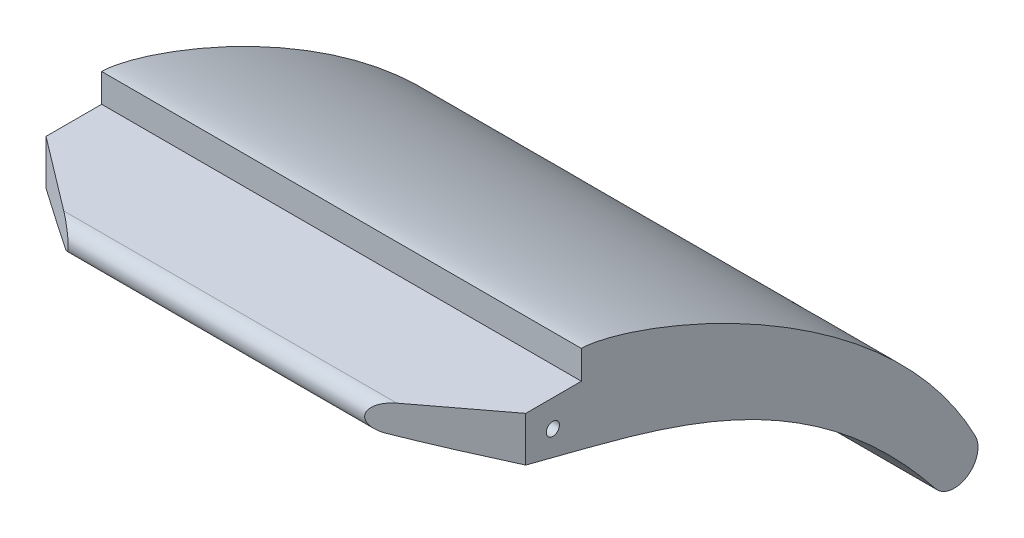
ISO-10303-21;
HEADER;
FILE_DESCRIPTION(('STEP AP214'),'2;1');
FILE_NAME('part.step','',(''),(''),'','','');
FILE_SCHEMA(('AUTOMOTIVE_DESIGN { 1 0 10303 214 1 1 1 1 }'));
ENDSEC;
DATA;
#1=APPLICATION_CONTEXT('core data for automotive mechanical design processes');
#2=APPLICATION_PROTOCOL_DEFINITION('international standard','automotive_design',2000,#1);
#3=PRODUCT_CONTEXT('',#1,'mechanical');
#4=PRODUCT('Part','Part','',(#3));
#5=PRODUCT_RELATED_PRODUCT_CATEGORY('part','',(#4));
#6=PRODUCT_DEFINITION_FORMATION('','',#4);
#7=PRODUCT_DEFINITION_CONTEXT('part definition',#1,'design');
#8=PRODUCT_DEFINITION('design','',#6,#7);
#9=PRODUCT_DEFINITION_SHAPE('','',#8);
#10=(LENGTH_UNIT() NAMED_UNIT(*) SI_UNIT(.MILLI.,.METRE.));
#11=(NAMED_UNIT(*) PLANE_ANGLE_UNIT() SI_UNIT($,.RADIAN.));
#12=(NAMED_UNIT(*) SI_UNIT($,.STERADIAN.) SOLID_ANGLE_UNIT());
#13=UNCERTAINTY_MEASURE_WITH_UNIT(LENGTH_MEASURE(1.E-05),#10,'distance_accuracy_value','');
#14=(GEOMETRIC_REPRESENTATION_CONTEXT(3) GLOBAL_UNCERTAINTY_ASSIGNED_CONTEXT((#13)) GLOBAL_UNIT_ASSIGNED_CONTEXT((#10,
#11,#12)) REPRESENTATION_CONTEXT('',''));
#15=CARTESIAN_POINT('',(0.,0.,0.));
#16=DIRECTION('',(0.,0.,1.));
#17=DIRECTION('',(1.,0.,0.));
#18=AXIS2_PLACEMENT_3D('',#15,#16,#17);
#19=CARTESIAN_POINT('',(82.55,-11.5520753106757,-24.6556689200418));
#20=DIRECTION('',(-1.,0.,0.));
#21=DIRECTION('',(0.,0.,1.));
#22=AXIS2_PLACEMENT_3D('',#19,#20,#21);
#23=PLANE('',#22);
#24=DIRECTION('',(0.,0.,1.));
#25=VECTOR('',#24,1.);
#26=CARTESIAN_POINT('',(82.55,4.6355,14.2350370609778));
#27=LINE('',#26,#25);
#28=CARTESIAN_POINT('',(82.55,4.6355,-4.91161356874394));
#29=VERTEX_POINT('',#28);
#30=CARTESIAN_POINT('',(82.55,4.6355,4.66171174611691));
#31=VERTEX_POINT('',#30);
#32=EDGE_CURVE('E111',#29,#31,#27,.T.);
#33=ORIENTED_EDGE('',*,*,#32,.T.);
#34=DIRECTION('',(0.,1.,0.));
#35=VECTOR('',#34,1.);
#36=CARTESIAN_POINT('',(82.55,-43.4000524434464,4.66171174611692));
#37=LINE('',#36,#35);
#38=CARTESIAN_POINT('',(82.55,-3.07681509877804,4.66171174611691));
#39=VERTEX_POINT('',#38);
#40=EDGE_CURVE('E99',#39,#31,#37,.T.);
#41=ORIENTED_EDGE('',*,*,#40,.F.);
#42=CARTESIAN_POINT('',(82.55,0.,15.0043695834243));
#43=CARTESIAN_POINT('',(82.55,-8.32117200788797,-9.37411641729812));
#44=CARTESIAN_POINT('',(82.55,-8.5343658913165,-39.4233813649988));
#45=CARTESIAN_POINT('',(82.55,-41.849988787792,-65.857227596868));
#46=B_SPLINE_CURVE_WITH_KNOTS('',3,(#42,#43,#44,#45),.UNSPECIFIED.,.F.,.F.,(4,4),(0.,1.),.UNSPECIFIED.);
#47=CARTESIAN_POINT('',(82.55,-41.8499887877919,-65.8572275968679));
#48=VERTEX_POINT('',#47);
#49=EDGE_CURVE('E146',#39,#48,#46,.T.);
#50=ORIENTED_EDGE('',*,*,#49,.T.);
#51=CARTESIAN_POINT('',(82.55,-39.3041759977397,-69.0658162424412));
#52=DIRECTION('',(1.,0.,0.));
#53=DIRECTION('',(0.,0.,1.));
#54=AXIS2_PLACEMENT_3D('',#51,#52,#53);
#55=CIRCLE('',#54,4.09587644570674);
#56=CARTESIAN_POINT('',(82.55,-37.4179314701647,-72.7015122474296));
#57=VERTEX_POINT('',#56);
#58=EDGE_CURVE('E215',#48,#57,#55,.T.);
#59=ORIENTED_EDGE('',*,*,#58,.T.);
#60=CARTESIAN_POINT('',(82.55,-37.4179314701647,-72.7015122474296));
#61=CARTESIAN_POINT('',(82.55,-6.98888389724203,-56.9145420538283));
#62=CARTESIAN_POINT('',(82.55,9.52500000000001,-13.3568598094038));
#63=CARTESIAN_POINT('',(82.55,9.52500000000001,-4.91161356874394));
#64=B_SPLINE_CURVE_WITH_KNOTS('',3,(#60,#61,#62,#63),.UNSPECIFIED.,.F.,.F.,(4,4),(0.,1.),.UNSPECIFIED.);
#65=CARTESIAN_POINT('',(82.55,9.525,-4.91161356874394));
#66=VERTEX_POINT('',#65);
#67=EDGE_CURVE('E121',#57,#66,#64,.T.);
#68=ORIENTED_EDGE('',*,*,#67,.T.);
#69=DIRECTION('',(0.,-1.,0.));
#70=VECTOR('',#69,1.);
#71=CARTESIAN_POINT('',(82.55,4.6355,-4.91161356874394));
#72=LINE('',#71,#70);
#73=EDGE_CURVE('E117',#66,#29,#72,.T.);
#74=ORIENTED_EDGE('',*,*,#73,.T.);
#75=EDGE_LOOP('',(#33,#41,#50,#59,#68,#74));
#76=FACE_BOUND('',#75,.T.);
#77=CARTESIAN_POINT('',(82.55,0.,0.));
#78=DIRECTION('',(1.,0.,0.));
#79=DIRECTION('',(0.,0.,-1.));
#80=AXIS2_PLACEMENT_3D('',#77,#78,#79);
#81=CIRCLE('',#80,1.1303);
#82=CARTESIAN_POINT('',(82.55,0.,-1.1303));
#83=VERTEX_POINT('',#82);
#84=EDGE_CURVE('E130',#83,#83,#81,.T.);
#85=ORIENTED_EDGE('',*,*,#84,.F.);
#86=EDGE_LOOP('',(#85));
#87=FACE_BOUND('',#86,.T.);
#88=ADVANCED_FACE('F33',(#76,#87),#23,.F.);
#89=CARTESIAN_POINT('',(0.,-11.5520753106757,-24.6556689200418));
#90=DIRECTION('',(-1.,0.,0.));
#91=DIRECTION('',(0.,0.,1.));
#92=AXIS2_PLACEMENT_3D('',#89,#90,#91);
#93=PLANE('',#92);
#94=DIRECTION('',(0.,1.,0.));
#95=VECTOR('',#94,1.);
#96=CARTESIAN_POINT('',(0.,-43.4000524434464,4.66171174611692));
#97=LINE('',#96,#95);
#98=CARTESIAN_POINT('',(0.,-3.07681509877804,4.66171174611691));
#99=VERTEX_POINT('',#98);
#100=CARTESIAN_POINT('',(0.,4.6355,4.66171174611691));
#101=VERTEX_POINT('',#100);
#102=EDGE_CURVE('E169',#99,#101,#97,.T.);
#103=ORIENTED_EDGE('',*,*,#102,.T.);
#104=DIRECTION('',(0.,0.,1.));
#105=VECTOR('',#104,1.);
#106=CARTESIAN_POINT('',(0.,4.6355,14.2350370609778));
#107=LINE('',#106,#105);
#108=CARTESIAN_POINT('',(0.,4.6355,-4.91161356874394));
#109=VERTEX_POINT('',#108);
#110=EDGE_CURVE('E144',#109,#101,#107,.T.);
#111=ORIENTED_EDGE('',*,*,#110,.F.);
#112=DIRECTION('',(0.,-1.,0.));
#113=VECTOR('',#112,1.);
#114=CARTESIAN_POINT('',(0.,4.6355,-4.91161356874394));
#115=LINE('',#114,#113);
#116=CARTESIAN_POINT('',(0.,9.525,-4.91161356874394));
#117=VERTEX_POINT('',#116);
#118=EDGE_CURVE('E139',#117,#109,#115,.T.);
#119=ORIENTED_EDGE('',*,*,#118,.F.);
#120=CARTESIAN_POINT('',(0.,-37.4179314701647,-72.7015122474296));
#121=CARTESIAN_POINT('',(0.,-6.98888389724203,-56.9145420538283));
#122=CARTESIAN_POINT('',(0.,9.52500000000001,-13.3568598094038));
#123=CARTESIAN_POINT('',(0.,9.52500000000001,-4.91161356874394));
#124=B_SPLINE_CURVE_WITH_KNOTS('',3,(#120,#121,#122,#123),.UNSPECIFIED.,.F.,.F.,(4,4),(0.,1.),.UNSPECIFIED.);
#125=CARTESIAN_POINT('',(0.,-37.4179314701647,-72.7015122474296));
#126=VERTEX_POINT('',#125);
#127=EDGE_CURVE('E135',#126,#117,#124,.T.);
#128=ORIENTED_EDGE('',*,*,#127,.F.);
#129=CARTESIAN_POINT('',(0.,-39.3041759977397,-69.0658162424412));
#130=DIRECTION('',(1.,0.,0.));
#131=DIRECTION('',(0.,0.,1.));
#132=AXIS2_PLACEMENT_3D('',#129,#130,#131);
#133=CIRCLE('',#132,4.09587644570674);
#134=CARTESIAN_POINT('',(0.,-41.8499887877919,-65.8572275968679));
#135=VERTEX_POINT('',#134);
#136=EDGE_CURVE('E129',#135,#126,#133,.T.);
#137=ORIENTED_EDGE('',*,*,#136,.F.);
#138=CARTESIAN_POINT('',(0.,0.,15.0043695834243));
#139=CARTESIAN_POINT('',(0.,-8.32117200788797,-9.37411641729812));
#140=CARTESIAN_POINT('',(0.,-8.5343658913165,-39.4233813649988));
#141=CARTESIAN_POINT('',(0.,-41.849988787792,-65.857227596868));
#142=B_SPLINE_CURVE_WITH_KNOTS('',3,(#138,#139,#140,#141),.UNSPECIFIED.,.F.,.F.,(4,4),(0.,1.),.UNSPECIFIED.);
#143=EDGE_CURVE('E125',#99,#135,#142,.T.);
#144=ORIENTED_EDGE('',*,*,#143,.F.);
#145=EDGE_LOOP('',(#103,#111,#119,#128,#137,#144));
#146=FACE_BOUND('',#145,.T.);
#147=CARTESIAN_POINT('',(0.,0.,0.));
#148=DIRECTION('',(1.,0.,0.));
#149=DIRECTION('',(0.,0.,-1.));
#150=AXIS2_PLACEMENT_3D('',#147,#148,#149);
#151=CIRCLE('',#150,1.1303);
#152=CARTESIAN_POINT('',(0.,0.,-1.1303));
#153=VERTEX_POINT('',#152);
#154=EDGE_CURVE('E183',#153,#153,#151,.T.);
#155=ORIENTED_EDGE('',*,*,#154,.T.);
#156=EDGE_LOOP('',(#155));
#157=FACE_BOUND('',#156,.T.);
#158=ADVANCED_FACE('F195',(#146,#157),#93,.T.);
#159=DIRECTION('',(-1.,0.,0.));
#160=VECTOR('',#159,1.);
#161=SURFACE_OF_LINEAR_EXTRUSION('',#46,#160);
#162=ORIENTED_EDGE('',*,*,#49,.F.);
#163=CARTESIAN_POINT('',(82.5499999999755,-3.07681509877715,4.66171174618639));
#164=CARTESIAN_POINT('',(82.093866387548,-2.98455770400678,5.00758860997064));
#165=CARTESIAN_POINT('',(81.6378136555069,-2.89166639047412,5.35340414381812));
#166=CARTESIAN_POINT('',(80.7259305421681,-2.70439216075581,6.04486660747262));
#167=CARTESIAN_POINT('',(80.2701001492855,-2.61000933337655,6.39051354606417));
#168=CARTESIAN_POINT('',(79.3586922097506,-2.41952244197865,7.08161569507635));
#169=CARTESIAN_POINT('',(78.9031146510341,-2.32341846897501,7.42707091464502));
#170=CARTESIAN_POINT('',(77.9922443492805,-2.12925152533336,8.1177653838324));
#171=CARTESIAN_POINT('',(77.5369515949778,-2.03118863799767,8.46300464199364));
#172=CARTESIAN_POINT('',(76.6266836342697,-1.83285960739144,9.15324236818809));
#173=CARTESIAN_POINT('',(76.1717084193955,-1.73259352539228,9.49824084264292));
#174=CARTESIAN_POINT('',(75.262091509596,-1.52960240861048,10.1879848901423));
#175=CARTESIAN_POINT('',(74.8074498254858,-1.42687729743348,10.5327304549859));
#176=CARTESIAN_POINT('',(73.8985567652707,-1.21871338889748,11.2219256220315));
#177=CARTESIAN_POINT('',(73.4443053924816,-1.11327456871656,11.5663752217194));
#178=CARTESIAN_POINT('',(72.536233532883,-0.899416513594967,12.2549476889989));
#179=CARTESIAN_POINT('',(72.0824130597402,-0.790997187187326,12.5990705462274));
#180=CARTESIAN_POINT('',(71.1752444679711,-0.570903365899336,13.2869580838382));
#181=CARTESIAN_POINT('',(70.721896379558,-0.459228674633927,13.6307227413105));
#182=CARTESIAN_POINT('',(69.8157169234941,-0.232338175340028,14.3178602373846));
#183=CARTESIAN_POINT('',(69.362885611221,-0.117122019117585,14.6612330339947));
#184=CARTESIAN_POINT('',(68.9103658557217,0.,15.0043695834243));
#185=B_SPLINE_CURVE_WITH_KNOTS('',3,(#163,#164,#165,#166,#167,#168,#169,#170,#171,#172,#173,
#174,#175,#176,#177,#178,#179,#180,#181,#182,#183,#184),.UNSPECIFIED.,.F.,.F.,(4,2,2,2,2,2,2,2,
2,2,4),(0.,1.73948357403816,3.4788639646314,5.21815264595893,6.95736752127614,8.6965340896618,
10.4357547588221,12.1749900593761,13.9142787939952,15.653672672004,17.3932381162987),.UNSPECIFIED.);
#186=CARTESIAN_POINT('',(68.9103658557218,0.,15.0043695834243));
#187=VERTEX_POINT('',#186);
#188=EDGE_CURVE('E101',#39,#187,#185,.T.);
#189=ORIENTED_EDGE('',*,*,#188,.T.);
#190=DIRECTION('',(-1.,0.,0.));
#191=VECTOR('',#190,1.);
#192=CARTESIAN_POINT('',(82.55,0.,15.0043695834243));
#193=LINE('',#192,#191);
#194=CARTESIAN_POINT('',(13.6396341442782,0.,15.0043695834243));
#195=VERTEX_POINT('',#194);
#196=EDGE_CURVE('E57',#187,#195,#193,.T.);
#197=ORIENTED_EDGE('',*,*,#196,.T.);
#198=CARTESIAN_POINT('',(13.6396341442782,0.,15.0043695834243));
#199=CARTESIAN_POINT('',(13.187114388779,-0.117122019117582,14.6612330339947));
#200=CARTESIAN_POINT('',(12.734283076506,-0.23233817534002,14.3178602373846));
#201=CARTESIAN_POINT('',(11.8281036204421,-0.45922867463391,13.6307227413105));
#202=CARTESIAN_POINT('',(11.374755532029,-0.570903365899313,13.2869580838383));
#203=CARTESIAN_POINT('',(10.4675869402599,-0.790997187187295,12.5990705462275));
#204=CARTESIAN_POINT('',(10.0137664671172,-0.899416513594932,12.254947688999));
#205=CARTESIAN_POINT('',(9.1056946075186,-1.11327456871652,11.5663752217195));
#206=CARTESIAN_POINT('',(8.65144323472946,-1.21871338889744,11.2219256220317));
#207=CARTESIAN_POINT('',(7.74255017451444,-1.42687729743343,10.532730454986));
#208=CARTESIAN_POINT('',(7.28790849040424,-1.52960240861043,10.1879848901425));
#209=CARTESIAN_POINT('',(6.37829158060475,-1.73259352539224,9.49824084264309));
#210=CARTESIAN_POINT('',(5.92331636573063,-1.83285960739141,9.15324236818822));
#211=CARTESIAN_POINT('',(5.0130484050224,-2.03118863799758,8.46300464199391));
#212=CARTESIAN_POINT('',(4.55775565071959,-2.12925152533318,8.11776538383283));
#213=CARTESIAN_POINT('',(3.64688534896644,-2.32341846897506,7.42707091464506));
#214=CARTESIAN_POINT('',(3.19130779025042,-2.41952244197901,7.08161569507582));
#215=CARTESIAN_POINT('',(2.27989985071418,-2.61000933337604,6.39051354606525));
#216=CARTESIAN_POINT('',(1.82406945782976,-2.70439216075411,6.04486660747587));
#217=CARTESIAN_POINT('',(0.912186344496103,-2.89166639047565,5.35340414381551));
#218=CARTESIAN_POINT('',(0.45613361246206,-2.98455770401271,5.00758860996001));
#219=CARTESIAN_POINT('',(5.17225151597245E-11,-3.07681509879383,4.66171174615614));
#220=B_SPLINE_CURVE_WITH_KNOTS('',3,(#198,#199,#200,#201,#202,#203,#204,#205,#206,#207,#208,
#209,#210,#211,#212,#213,#214,#215,#216,#217,#218,#219),.UNSPECIFIED.,.F.,.F.,(4,2,2,2,2,2,2,2,
2,2,4),(0.,1.73956544429455,3.47895932230328,5.21824805692232,6.95748335747634,8.69670402663656,
10.4358705950222,12.1750854703393,13.9143741516668,15.65375454226,17.393238116298),.UNSPECIFIED.);
#221=EDGE_CURVE('E167',#195,#99,#220,.T.);
#222=ORIENTED_EDGE('',*,*,#221,.T.);
#223=ORIENTED_EDGE('',*,*,#143,.T.);
#224=DIRECTION('',(-1.,0.,0.));
#225=VECTOR('',#224,1.);
#226=CARTESIAN_POINT('',(82.55,-41.8499887877919,-65.8572275968679));
#227=LINE('',#226,#225);
#228=EDGE_CURVE('E157',#48,#135,#227,.T.);
#229=ORIENTED_EDGE('',*,*,#228,.F.);
#230=EDGE_LOOP('',(#162,#189,#197,#222,#223,#229));
#231=FACE_BOUND('',#230,.T.);
#232=ADVANCED_FACE('F35',(#231),#161,.F.);
#233=CARTESIAN_POINT('',(82.55,-39.3041759977397,-69.0658162424412));
#234=DIRECTION('',(-1.,0.,0.));
#235=DIRECTION('',(0.,0.,1.));
#236=AXIS2_PLACEMENT_3D('',#233,#234,#235);
#237=CYLINDRICAL_SURFACE('',#236,4.09587644570674);
#238=ORIENTED_EDGE('',*,*,#136,.T.);
#239=DIRECTION('',(-1.,0.,0.));
#240=VECTOR('',#239,1.);
#241=CARTESIAN_POINT('',(82.55,-37.4179314701647,-72.7015122474296));
#242=LINE('',#241,#240);
#243=EDGE_CURVE('E154',#57,#126,#242,.T.);
#244=ORIENTED_EDGE('',*,*,#243,.F.);
#245=ORIENTED_EDGE('',*,*,#58,.F.);
#246=ORIENTED_EDGE('',*,*,#228,.T.);
#247=EDGE_LOOP('',(#238,#244,#245,#246));
#248=FACE_BOUND('',#247,.T.);
#249=ADVANCED_FACE('F209',(#248),#237,.T.);
#250=DIRECTION('',(-1.,0.,0.));
#251=VECTOR('',#250,1.);
#252=SURFACE_OF_LINEAR_EXTRUSION('',#64,#251);
#253=ORIENTED_EDGE('',*,*,#127,.T.);
#254=DIRECTION('',(-1.,0.,0.));
#255=VECTOR('',#254,1.);
#256=CARTESIAN_POINT('',(82.55,9.525,-4.91161356874394));
#257=LINE('',#256,#255);
#258=EDGE_CURVE('E151',#66,#117,#257,.T.);
#259=ORIENTED_EDGE('',*,*,#258,.F.);
#260=ORIENTED_EDGE('',*,*,#67,.F.);
#261=ORIENTED_EDGE('',*,*,#243,.T.);
#262=EDGE_LOOP('',(#253,#259,#260,#261));
#263=FACE_BOUND('',#262,.T.);
#264=ADVANCED_FACE('F206',(#263),#252,.F.);
#265=CARTESIAN_POINT('',(82.55,4.6355,-4.91161356874394));
#266=DIRECTION('',(0.,0.,-1.));
#267=DIRECTION('',(0.,1.,0.));
#268=AXIS2_PLACEMENT_3D('',#265,#266,#267);
#269=PLANE('',#268);
#270=ORIENTED_EDGE('',*,*,#118,.T.);
#271=DIRECTION('',(-1.,0.,0.));
#272=VECTOR('',#271,1.);
#273=CARTESIAN_POINT('',(82.55,4.6355,-4.91161356874394));
#274=LINE('',#273,#272);
#275=EDGE_CURVE('E149',#29,#109,#274,.T.);
#276=ORIENTED_EDGE('',*,*,#275,.F.);
#277=ORIENTED_EDGE('',*,*,#73,.F.);
#278=ORIENTED_EDGE('',*,*,#258,.T.);
#279=EDGE_LOOP('',(#270,#276,#277,#278));
#280=FACE_BOUND('',#279,.T.);
#281=ADVANCED_FACE('F203',(#280),#269,.F.);
#282=CARTESIAN_POINT('',(82.55,4.6355,14.2350370609778));
#283=DIRECTION('',(0.,-1.,0.));
#284=DIRECTION('',(0.,0.,-1.));
#285=AXIS2_PLACEMENT_3D('',#282,#283,#284);
#286=PLANE('',#285);
#287=DIRECTION('',(-1.,0.,0.));
#288=VECTOR('',#287,1.);
#289=CARTESIAN_POINT('',(82.55,4.6355,14.2350370609778));
#290=LINE('',#289,#288);
#291=CARTESIAN_POINT('',(69.9249420223638,4.6355,14.2350370609778));
#292=VERTEX_POINT('',#291);
#293=CARTESIAN_POINT('',(12.6250579776362,4.6355,14.2350370609778));
#294=VERTEX_POINT('',#293);
#295=EDGE_CURVE('E113',#292,#294,#290,.T.);
#296=ORIENTED_EDGE('',*,*,#295,.F.);
#297=DIRECTION('',(-0.796822078017211,0.,0.604214015051235));
#298=VECTOR('',#297,1.);
#299=CARTESIAN_POINT('',(64.3137251642566,4.6355,18.4899089585997));
#300=LINE('',#299,#298);
#301=EDGE_CURVE('E50',#31,#292,#300,.T.);
#302=ORIENTED_EDGE('',*,*,#301,.F.);
#303=ORIENTED_EDGE('',*,*,#32,.F.);
#304=ORIENTED_EDGE('',*,*,#275,.T.);
#305=ORIENTED_EDGE('',*,*,#110,.T.);
#306=DIRECTION('',(-0.796822078017211,0.,-0.604214015051235));
#307=VECTOR('',#306,1.);
#308=CARTESIAN_POINT('',(18.2362748357434,4.6355,18.4899089585997));
#309=LINE('',#308,#307);
#310=EDGE_CURVE('E165',#294,#101,#309,.T.);
#311=ORIENTED_EDGE('',*,*,#310,.F.);
#312=EDGE_LOOP('',(#296,#302,#303,#304,#305,#311));
#313=FACE_BOUND('',#312,.T.);
#314=ADVANCED_FACE('F109',(#313),#286,.F.);
#315=CARTESIAN_POINT('',(82.55,2.25390871749606,14.2350370609778));
#316=DIRECTION('',(-1.,0.,0.));
#317=DIRECTION('',(0.,0.,1.));
#318=AXIS2_PLACEMENT_3D('',#315,#316,#317);
#319=CYLINDRICAL_SURFACE('',#318,2.38159128250394);
#320=ORIENTED_EDGE('',*,*,#196,.F.);
#321=CARTESIAN_POINT('',(69.9249420223638,2.25390871749606,14.2350370609778));
#322=DIRECTION('',(-0.604214015051235,0.,-0.796822078017211));
#323=DIRECTION('',(-0.796822078017211,0.,0.604214015051235));
#324=AXIS2_PLACEMENT_3D('',#321,#322,#323);
#325=ELLIPSE('',#324,3.94163528679815,2.38159128250394);
#326=EDGE_CURVE('E11',#187,#292,#325,.T.);
#327=ORIENTED_EDGE('',*,*,#326,.T.);
#328=ORIENTED_EDGE('',*,*,#295,.T.);
#329=CARTESIAN_POINT('',(12.6250579776362,2.25390871749606,14.2350370609778));
#330=DIRECTION('',(0.604214015051235,0.,-0.796822078017211));
#331=DIRECTION('',(-0.796822078017211,0.,-0.604214015051235));
#332=AXIS2_PLACEMENT_3D('',#329,#330,#331);
#333=ELLIPSE('',#332,3.94163528679815,2.38159128250394);
#334=EDGE_CURVE('E43',#294,#195,#333,.T.);
#335=ORIENTED_EDGE('',*,*,#334,.T.);
#336=EDGE_LOOP('',(#320,#327,#328,#335));
#337=FACE_BOUND('',#336,.T.);
#338=ADVANCED_FACE('F162',(#337),#319,.T.);
#339=CARTESIAN_POINT('',(82.55,0.,0.));
#340=DIRECTION('',(-1.,0.,0.));
#341=DIRECTION('',(0.,0.,1.));
#342=AXIS2_PLACEMENT_3D('',#339,#340,#341);
#343=CYLINDRICAL_SURFACE('',#342,1.1303);
#344=ORIENTED_EDGE('',*,*,#84,.T.);
#345=EDGE_LOOP('',(#344));
#346=FACE_BOUND('',#345,.T.);
#347=ORIENTED_EDGE('',*,*,#154,.F.);
#348=EDGE_LOOP('',(#347));
#349=FACE_BOUND('',#348,.T.);
#350=ADVANCED_FACE('F188',(#346,#349),#343,.F.);
#351=CARTESIAN_POINT('',(18.2362748357434,-43.4000524434464,18.4899089585997));
#352=DIRECTION('',(0.604214015051235,0.,-0.796822078017211));
#353=DIRECTION('',(-0.796822078017211,0.,-0.604214015051235));
#354=AXIS2_PLACEMENT_3D('',#351,#352,#353);
#355=PLANE('',#354);
#356=ORIENTED_EDGE('',*,*,#334,.F.);
#357=ORIENTED_EDGE('',*,*,#310,.T.);
#358=ORIENTED_EDGE('',*,*,#102,.F.);
#359=ORIENTED_EDGE('',*,*,#221,.F.);
#360=EDGE_LOOP('',(#356,#357,#358,#359));
#361=FACE_BOUND('',#360,.T.);
#362=ADVANCED_FACE('F164',(#361),#355,.F.);
#363=CARTESIAN_POINT('',(64.3137251642566,-43.4000524434464,18.4899089585997));
#364=DIRECTION('',(-0.604214015051235,0.,-0.796822078017211));
#365=DIRECTION('',(-0.796822078017211,0.,0.604214015051235));
#366=AXIS2_PLACEMENT_3D('',#363,#364,#365);
#367=PLANE('',#366);
#368=ORIENTED_EDGE('',*,*,#40,.T.);
#369=ORIENTED_EDGE('',*,*,#301,.T.);
#370=ORIENTED_EDGE('',*,*,#326,.F.);
#371=ORIENTED_EDGE('',*,*,#188,.F.);
#372=EDGE_LOOP('',(#368,#369,#370,#371));
#373=FACE_BOUND('',#372,.T.);
#374=ADVANCED_FACE('F100',(#373),#367,.F.);
#375=CLOSED_SHELL('',(#88,#158,#232,#249,#264,#281,#314,#338,#350,#362,#374));
#376=MANIFOLD_SOLID_BREP('B2',#375);
#377=ADVANCED_BREP_SHAPE_REPRESENTATION('',(#18,#376),#14);
#378=SHAPE_DEFINITION_REPRESENTATION(#9,#377);
ENDSEC;
END-ISO-10303-21;
